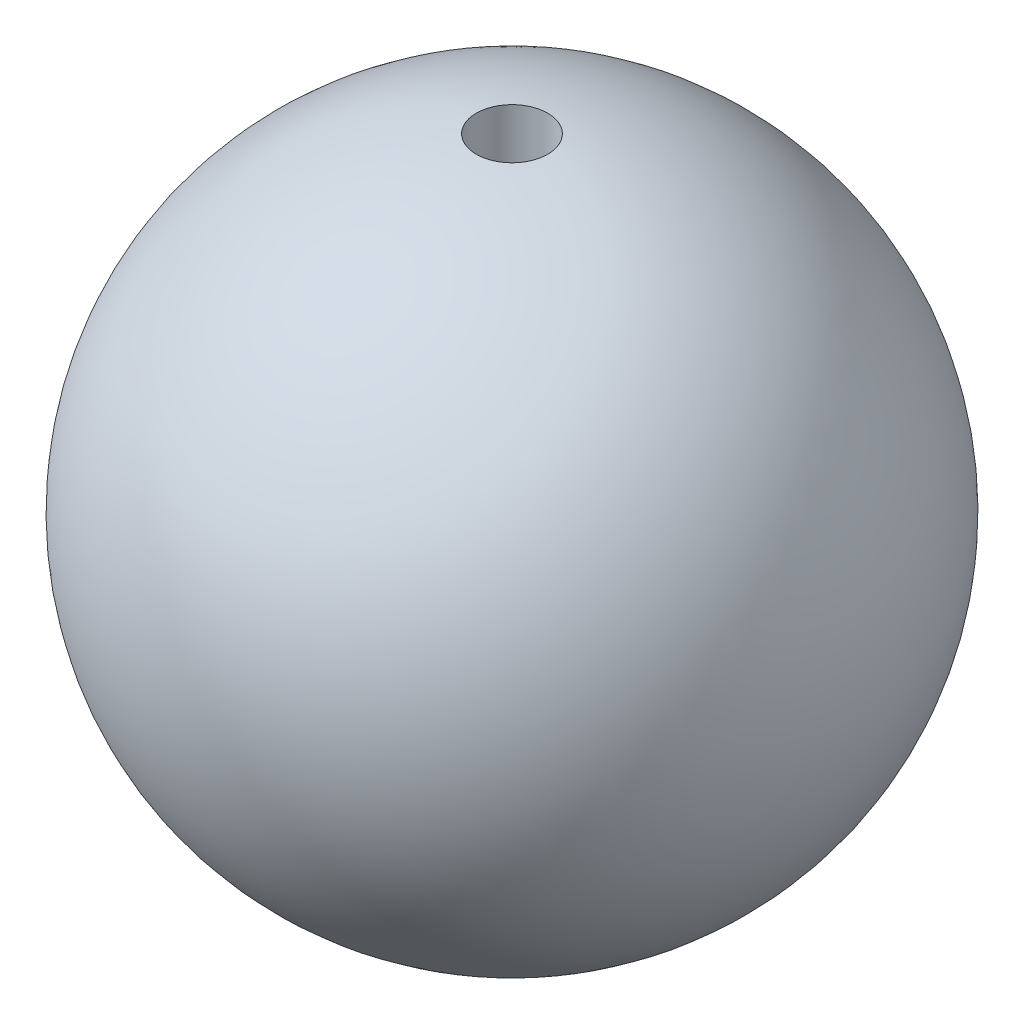
ISO-10303-21;
HEADER;
FILE_DESCRIPTION(('STEP AP214'),'2;1');
FILE_NAME('part.step','',(''),(''),'','','');
FILE_SCHEMA(('AUTOMOTIVE_DESIGN { 1 0 10303 214 1 1 1 1 }'));
ENDSEC;
DATA;
#1=APPLICATION_CONTEXT('core data for automotive mechanical design processes');
#2=APPLICATION_PROTOCOL_DEFINITION('international standard','automotive_design',2000,#1);
#3=PRODUCT_CONTEXT('',#1,'mechanical');
#4=PRODUCT('Part','Part','',(#3));
#5=PRODUCT_RELATED_PRODUCT_CATEGORY('part','',(#4));
#6=PRODUCT_DEFINITION_FORMATION('','',#4);
#7=PRODUCT_DEFINITION_CONTEXT('part definition',#1,'design');
#8=PRODUCT_DEFINITION('design','',#6,#7);
#9=PRODUCT_DEFINITION_SHAPE('','',#8);
#10=(LENGTH_UNIT() NAMED_UNIT(*) SI_UNIT(.MILLI.,.METRE.));
#11=(NAMED_UNIT(*) PLANE_ANGLE_UNIT() SI_UNIT($,.RADIAN.));
#12=(NAMED_UNIT(*) SI_UNIT($,.STERADIAN.) SOLID_ANGLE_UNIT());
#13=UNCERTAINTY_MEASURE_WITH_UNIT(LENGTH_MEASURE(1.E-05),#10,'distance_accuracy_value','');
#14=(GEOMETRIC_REPRESENTATION_CONTEXT(3) GLOBAL_UNCERTAINTY_ASSIGNED_CONTEXT((#13)) GLOBAL_UNIT_ASSIGNED_CONTEXT((#10,
#11,#12)) REPRESENTATION_CONTEXT('',''));
#15=CARTESIAN_POINT('',(0.,0.,0.));
#16=DIRECTION('',(0.,0.,1.));
#17=DIRECTION('',(1.,0.,0.));
#18=AXIS2_PLACEMENT_3D('',#15,#16,#17);
#19=CARTESIAN_POINT('',(0.,0.,0.));
#20=DIRECTION('',(0.,-1.,0.));
#21=DIRECTION('',(-1.,0.,0.));
#22=AXIS2_PLACEMENT_3D('',#19,#20,#21);
#23=SPHERICAL_SURFACE('',#22,924.);
#24=CARTESIAN_POINT('',(0.,-918.572806042069,0.));
#25=DIRECTION('',(0.,-1.,0.));
#26=DIRECTION('',(0.,0.,-1.));
#27=AXIS2_PLACEMENT_3D('',#24,#25,#26);
#28=CIRCLE('',#27,99.9999999999998);
#29=CARTESIAN_POINT('',(-100.000000000001,-918.572806042069,0.));
#30=VERTEX_POINT('',#29);
#31=EDGE_CURVE('E10',#30,#30,#28,.T.);
#32=CARTESIAN_POINT('',(0.,918.572806042069,0.));
#33=DIRECTION('',(0.,-1.,0.));
#34=DIRECTION('',(0.,0.,-1.));
#35=AXIS2_PLACEMENT_3D('',#32,#33,#34);
#36=CIRCLE('',#35,100.);
#37=CARTESIAN_POINT('',(-100.,918.572806042069,0.));
#38=VERTEX_POINT('',#37);
#39=EDGE_CURVE('E52',#38,#38,#36,.T.);
#40=CARTESIAN_POINT('',(-100.000000000001,-918.572806042069,0.));
#41=CARTESIAN_POINT('',(-106.996267866957,-917.811175764544,0.));
#42=CARTESIAN_POINT('',(-113.983830385509,-916.969586036063,0.));
#43=CARTESIAN_POINT('',(-127.937905393556,-915.126992683969,0.));
#44=CARTESIAN_POINT('',(-134.904417883051,-914.125989060355,0.));
#45=CARTESIAN_POINT('',(-148.812753500734,-911.965072924776,0.));
#46=CARTESIAN_POINT('',(-155.754576628922,-910.80516041281,0.));
#47=CARTESIAN_POINT('',(-169.609910025978,-908.327036769075,0.));
#48=CARTESIAN_POINT('',(-176.523420294847,-907.008825637307,0.));
#49=CARTESIAN_POINT('',(-190.318518467541,-904.214791690232,0.));
#50=CARTESIAN_POINT('',(-197.200106371366,-902.738968874926,0.));
#51=CARTESIAN_POINT('',(-210.927767185387,-899.630482382514,0.));
#52=CARTESIAN_POINT('',(-217.773840095583,-897.997818705407,0.));
#53=CARTESIAN_POINT('',(-231.426896778437,-894.576502764093,0.));
#54=CARTESIAN_POINT('',(-238.233880551095,-892.787850499884,0.));
#55=CARTESIAN_POINT('',(-251.805205237425,-889.055491211039,0.));
#56=CARTESIAN_POINT('',(-258.569546151098,-887.111784186402,0.));
#57=CARTESIAN_POINT('',(-272.052053656515,-883.07033012207,0.));
#58=CARTESIAN_POINT('',(-278.770220248259,-880.972583082374,0.));
#59=CARTESIAN_POINT('',(-292.156871754216,-876.624144161279,0.));
#60=CARTESIAN_POINT('',(-298.825356668428,-874.373452279879,0.));
#61=CARTESIAN_POINT('',(-312.109163400753,-869.72029869449,0.));
#62=CARTESIAN_POINT('',(-318.724485218867,-867.3178369905,0.));
#63=CARTESIAN_POINT('',(-331.898512095388,-862.362398014171,0.));
#64=CARTESIAN_POINT('',(-338.457217153795,-859.809420741831,0.));
#65=CARTESIAN_POINT('',(-351.514586405208,-854.5542834626,0.));
#66=CARTESIAN_POINT('',(-358.013250598213,-851.852123455709,0.));
#67=CARTESIAN_POINT('',(-370.947145358689,-846.300031425107,0.));
#68=CARTESIAN_POINT('',(-377.38237592616,-843.450099401396,0.));
#69=CARTESIAN_POINT('',(-390.18604379225,-837.603951202268,0.));
#70=CARTESIAN_POINT('',(-396.55448109087,-834.60773502685,0.));
#71=CARTESIAN_POINT('',(-409.22123764673,-828.47058276005,0.));
#72=CARTESIAN_POINT('',(-415.519556903971,-825.329646668666,0.));
#73=CARTESIAN_POINT('',(-428.042789211098,-818.904694359656,0.));
#74=CARTESIAN_POINT('',(-434.267702260984,-815.620678142029,0.));
#75=CARTESIAN_POINT('',(-446.640872310634,-808.911280068151,0.));
#76=CARTESIAN_POINT('',(-452.789129310398,-805.485898211899,0.));
#77=CARTESIAN_POINT('',(-465.005777436889,-798.495557151205,0.));
#78=CARTESIAN_POINT('',(-471.074168563616,-794.930597946762,0.));
#79=CARTESIAN_POINT('',(-483.127916816727,-787.662963349317,0.));
#80=CARTESIAN_POINT('',(-489.11327394311,-783.960287956316,0.));
#81=CARTESIAN_POINT('',(-500.997829417818,-776.419154038933,0.));
#82=CARTESIAN_POINT('',(-506.897027766143,-772.580695514551,0.));
#83=CARTESIAN_POINT('',(-518.606185887968,-764.769999279936,0.));
#84=CARTESIAN_POINT('',(-524.416145661467,-760.797761569702,0.));
#85=CARTESIAN_POINT('',(-535.94379342569,-752.721580751063,0.));
#86=CARTESIAN_POINT('',(-541.661481416413,-748.617637642659,0.));
#87=CARTESIAN_POINT('',(-553.001600579498,-740.280188574847,0.));
#88=CARTESIAN_POINT('',(-558.62403175186,-736.04668261544,0.));
#89=CARTESIAN_POINT('',(-569.770701973403,-727.452318033721,0.));
#90=CARTESIAN_POINT('',(-575.294941022583,-723.091459411409,0.));
#91=CARTESIAN_POINT('',(-586.24234295614,-714.24466617903,0.));
#92=CARTESIAN_POINT('',(-591.665505840517,-709.758731568963,0.));
#93=CARTESIAN_POINT('',(-602.40792417172,-700.664128334694,0.));
#94=CARTESIAN_POINT('',(-607.727179618546,-696.055459710493,0.));
#95=CARTESIAN_POINT('',(-618.259006048894,-686.71779449737,0.));
#96=CARTESIAN_POINT('',(-623.471577032415,-681.988797908449,0.));
#97=CARTESIAN_POINT('',(-633.787313207202,-672.412945634968,0.));
#98=CARTESIAN_POINT('',(-638.890478398466,-667.566089950408,0.));
#99=CARTESIAN_POINT('',(-648.98473877731,-657.757049885476,0.));
#100=CARTESIAN_POINT('',(-653.975833964888,-652.794865505104,0.));
#101=CARTESIAN_POINT('',(-663.843348633361,-642.757758658069,0.));
#102=CARTESIAN_POINT('',(-668.719768114255,-637.682836191406,0.));
#103=CARTESIAN_POINT('',(-678.35538553515,-627.422902638528,0.));
#104=CARTESIAN_POINT('',(-683.114583475152,-622.237891552313,0.));
#105=CARTESIAN_POINT('',(-692.513273177949,-611.760487701079,0.));
#106=CARTESIAN_POINT('',(-697.152764940745,-606.468094936059,0.));
#107=CARTESIAN_POINT('',(-706.309620147869,-595.778690728757,0.));
#108=CARTESIAN_POINT('',(-710.826983592197,-590.381679286474,0.));
#109=CARTESIAN_POINT('',(-719.737223780701,-579.4858553445,0.));
#110=CARTESIAN_POINT('',(-724.130100524877,-573.987042844809,0.));
#111=CARTESIAN_POINT('',(-732.789073922214,-562.890487555192,0.));
#112=CARTESIAN_POINT('',(-737.055170575375,-557.292744765265,0.));
#113=CARTESIAN_POINT('',(-745.458356587948,-546.001251310924,0.));
#114=CARTESIAN_POINT('',(-749.59544594736,-540.307500646509,0.));
#115=CARTESIAN_POINT('',(-757.73845752059,-528.826963981807,0.));
#116=CARTESIAN_POINT('',(-761.744379734408,-523.04017798152,0.));
#117=CARTESIAN_POINT('',(-769.622965643088,-511.376591754683,0.));
#118=CARTESIAN_POINT('',(-773.495629337951,-505.499791528133,0.));
#119=CARTESIAN_POINT('',(-781.105676405683,-493.659244952141,0.));
#120=CARTESIAN_POINT('',(-784.843059778554,-487.6954986027,0.));
#121=CARTESIAN_POINT('',(-792.180595025116,-475.684173276293,0.));
#122=CARTESIAN_POINT('',(-795.780746898809,-469.636594299328,0.));
#123=CARTESIAN_POINT('',(-802.841939614333,-457.460760979774,0.));
#124=CARTESIAN_POINT('',(-806.302980456164,-451.332506637185,0.));
#125=CARTESIAN_POINT('',(-813.084144201031,-438.998521966503,0.));
#126=CARTESIAN_POINT('',(-816.404267104068,-432.79279163841,0.));
#127=CARTESIAN_POINT('',(-822.901861633495,-420.307094824756,0.));
#128=CARTESIAN_POINT('',(-826.079333259886,-414.027128339195,0.));
#129=CARTESIAN_POINT('',(-832.289966372179,-401.396237795144,0.));
#130=CARTESIAN_POINT('',(-835.323127858081,-395.045313736653,0.));
#131=CARTESIAN_POINT('',(-841.243557165604,-382.275823676124,0.));
#132=CARTESIAN_POINT('',(-844.130824987225,-375.857257674086,0.));
#133=CARTESIAN_POINT('',(-849.757959609157,-362.955834669704,0.));
#134=CARTESIAN_POINT('',(-852.497826409466,-356.47297766736,0.));
#135=CARTESIAN_POINT('',(-857.828728585452,-343.446357170032,0.));
#136=CARTESIAN_POINT('',(-860.419763961128,-336.902593675049,0.));
#137=CARTESIAN_POINT('',(-865.451650585004,-323.757576497586,0.));
#138=CARTESIAN_POINT('',(-867.892501833204,-317.156322815107,0.));
#139=CARTESIAN_POINT('',(-872.62274590597,-303.899771581721,0.));
#140=CARTESIAN_POINT('',(-874.912138730537,-297.244474030815,0.));
#141=CARTESIAN_POINT('',(-879.338270731838,-283.883309594345,0.));
#142=CARTESIAN_POINT('',(-881.475009908573,-277.177442708782,0.));
#143=CARTESIAN_POINT('',(-885.594719085959,-263.718640537523,0.));
#144=CARTESIAN_POINT('',(-887.577689086611,-256.965705251827,0.));
#145=CARTESIAN_POINT('',(-891.388824661917,-243.416291787844,0.));
#146=CARTESIAN_POINT('',(-893.21699023657,-236.619813609556,0.));
#147=CARTESIAN_POINT('',(-896.717562528768,-222.986862600387,0.));
#148=CARTESIAN_POINT('',(-898.389969246312,-216.150389769504,0.));
#149=CARTESIAN_POINT('',(-901.578150710269,-202.441018575164,0.));
#150=CARTESIAN_POINT('',(-903.093925456681,-195.568120211706,0.));
#151=CARTESIAN_POINT('',(-905.968051637265,-181.789486088927,0.));
#152=CARTESIAN_POINT('',(-907.326403071436,-174.883750329606,0.));
#153=CARTESIAN_POINT('',(-909.884973472478,-161.043046695244,0.));
#154=CARTESIAN_POINT('',(-911.085192439348,-154.108078820203,0.));
#155=CARTESIAN_POINT('',(-913.326871307007,-140.212531495768,0.));
#156=CARTESIAN_POINT('',(-914.368331207796,-133.251952046373,0.));
#157=CARTESIAN_POINT('',(-916.291948227917,-119.308815485641,0.));
#158=CARTESIAN_POINT('',(-917.17410534725,-112.326258374303,0.));
#159=CARTESIAN_POINT('',(-918.77865625635,-98.3428118759813,0.));
#160=CARTESIAN_POINT('',(-919.501050046117,-91.3419224889971,0.));
#161=CARTESIAN_POINT('',(-920.785697155682,-77.3254663964173,0.));
#162=CARTESIAN_POINT('',(-921.347950475478,-70.3098996908218,0.));
#163=CARTESIAN_POINT('',(-922.312023109293,-56.2677515806479,0.));
#164=CARTESIAN_POINT('',(-922.71384242331,-49.2411701760696,0.));
#165=CARTESIAN_POINT('',(-923.356837267601,-35.180661038007,0.));
#166=CARTESIAN_POINT('',(-923.598012797874,-28.1467333045227,0.));
#167=CARTESIAN_POINT('',(-923.919594164074,-14.0752037140255,0.));
#168=CARTESIAN_POINT('',(-924.,-7.03760185701254,0.));
#169=CARTESIAN_POINT('',(-924.,7.03760185701336,0.));
#170=CARTESIAN_POINT('',(-923.919594164074,14.0752037140263,0.));
#171=CARTESIAN_POINT('',(-923.598012797874,28.1467333045236,0.));
#172=CARTESIAN_POINT('',(-923.356837267601,35.1806610380078,0.));
#173=CARTESIAN_POINT('',(-922.71384242331,49.2411701760704,0.));
#174=CARTESIAN_POINT('',(-922.312023109293,56.2677515806487,0.));
#175=CARTESIAN_POINT('',(-921.347950475478,70.3098996908226,0.));
#176=CARTESIAN_POINT('',(-920.785697155682,77.3254663964181,0.));
#177=CARTESIAN_POINT('',(-919.501050046117,91.3419224889979,0.));
#178=CARTESIAN_POINT('',(-918.77865625635,98.3428118759821,0.));
#179=CARTESIAN_POINT('',(-917.174105347249,112.326258374304,0.));
#180=CARTESIAN_POINT('',(-916.291948227917,119.308815485642,0.));
#181=CARTESIAN_POINT('',(-914.368331207796,133.251952046374,0.));
#182=CARTESIAN_POINT('',(-913.326871307007,140.212531495768,0.));
#183=CARTESIAN_POINT('',(-911.085192439348,154.108078820204,0.));
#184=CARTESIAN_POINT('',(-909.884973472478,161.043046695244,0.));
#185=CARTESIAN_POINT('',(-907.326403071436,174.883750329606,0.));
#186=CARTESIAN_POINT('',(-905.968051637265,181.789486088928,0.));
#187=CARTESIAN_POINT('',(-903.093925456681,195.568120211707,0.));
#188=CARTESIAN_POINT('',(-901.578150710269,202.441018575164,0.));
#189=CARTESIAN_POINT('',(-898.389969246312,216.150389769505,0.));
#190=CARTESIAN_POINT('',(-896.717562528767,222.986862600387,0.));
#191=CARTESIAN_POINT('',(-893.21699023657,236.619813609557,0.));
#192=CARTESIAN_POINT('',(-891.388824661917,243.416291787845,0.));
#193=CARTESIAN_POINT('',(-887.577689086611,256.965705251828,0.));
#194=CARTESIAN_POINT('',(-885.594719085959,263.718640537524,0.));
#195=CARTESIAN_POINT('',(-881.475009908572,277.177442708782,0.));
#196=CARTESIAN_POINT('',(-879.338270731838,283.883309594345,0.));
#197=CARTESIAN_POINT('',(-874.912138730537,297.244474030815,0.));
#198=CARTESIAN_POINT('',(-872.62274590597,303.899771581722,0.));
#199=CARTESIAN_POINT('',(-867.892501833204,317.156322815108,0.));
#200=CARTESIAN_POINT('',(-865.451650585004,323.757576497587,0.));
#201=CARTESIAN_POINT('',(-860.419763961128,336.90259367505,0.));
#202=CARTESIAN_POINT('',(-857.828728585452,343.446357170033,0.));
#203=CARTESIAN_POINT('',(-852.497826409466,356.472977667361,0.));
#204=CARTESIAN_POINT('',(-849.757959609156,362.955834669705,0.));
#205=CARTESIAN_POINT('',(-844.130824987225,375.857257674087,0.));
#206=CARTESIAN_POINT('',(-841.243557165604,382.275823676124,0.));
#207=CARTESIAN_POINT('',(-835.323127858081,395.045313736653,0.));
#208=CARTESIAN_POINT('',(-832.289966372179,401.396237795144,0.));
#209=CARTESIAN_POINT('',(-826.079333259886,414.027128339196,0.));
#210=CARTESIAN_POINT('',(-822.901861633494,420.307094824757,0.));
#211=CARTESIAN_POINT('',(-816.404267104067,432.792791638411,0.));
#212=CARTESIAN_POINT('',(-813.084144201031,438.998521966504,0.));
#213=CARTESIAN_POINT('',(-806.302980456164,451.332506637186,0.));
#214=CARTESIAN_POINT('',(-802.841939614332,457.460760979775,0.));
#215=CARTESIAN_POINT('',(-795.780746898809,469.636594299329,0.));
#216=CARTESIAN_POINT('',(-792.180595025116,475.684173276294,0.));
#217=CARTESIAN_POINT('',(-784.843059778553,487.695498602701,0.));
#218=CARTESIAN_POINT('',(-781.105676405683,493.659244952142,0.));
#219=CARTESIAN_POINT('',(-773.49562933795,505.499791528133,0.));
#220=CARTESIAN_POINT('',(-769.622965643088,511.376591754683,0.));
#221=CARTESIAN_POINT('',(-761.744379734408,523.040177981521,0.));
#222=CARTESIAN_POINT('',(-757.738457520589,528.826963981808,0.));
#223=CARTESIAN_POINT('',(-749.595445947359,540.30750064651,0.));
#224=CARTESIAN_POINT('',(-745.458356587947,546.001251310925,0.));
#225=CARTESIAN_POINT('',(-737.055170575375,557.292744765266,0.));
#226=CARTESIAN_POINT('',(-732.789073922214,562.890487555192,0.));
#227=CARTESIAN_POINT('',(-724.130100524877,573.98704284481,0.));
#228=CARTESIAN_POINT('',(-719.737223780701,579.485855344501,0.));
#229=CARTESIAN_POINT('',(-710.826983592196,590.381679286475,0.));
#230=CARTESIAN_POINT('',(-706.309620147868,595.778690728757,0.));
#231=CARTESIAN_POINT('',(-697.152764940744,606.46809493606,0.));
#232=CARTESIAN_POINT('',(-692.513273177948,611.760487701079,0.));
#233=CARTESIAN_POINT('',(-683.114583475151,622.237891552314,0.));
#234=CARTESIAN_POINT('',(-678.35538553515,627.422902638529,0.));
#235=CARTESIAN_POINT('',(-668.719768114255,637.682836191406,0.));
#236=CARTESIAN_POINT('',(-663.843348633361,642.757758658069,0.));
#237=CARTESIAN_POINT('',(-653.975833964888,652.794865505105,0.));
#238=CARTESIAN_POINT('',(-648.984738777309,657.757049885477,0.));
#239=CARTESIAN_POINT('',(-638.890478398466,667.566089950409,0.));
#240=CARTESIAN_POINT('',(-633.787313207201,672.412945634969,0.));
#241=CARTESIAN_POINT('',(-623.471577032415,681.988797908449,0.));
#242=CARTESIAN_POINT('',(-618.259006048893,686.717794497371,0.));
#243=CARTESIAN_POINT('',(-607.727179618545,696.055459710493,0.));
#244=CARTESIAN_POINT('',(-602.40792417172,700.664128334695,0.));
#245=CARTESIAN_POINT('',(-591.665505840517,709.758731568963,0.));
#246=CARTESIAN_POINT('',(-586.24234295614,714.24466617903,0.));
#247=CARTESIAN_POINT('',(-575.294941022582,723.091459411409,0.));
#248=CARTESIAN_POINT('',(-569.770701973402,727.452318033722,0.));
#249=CARTESIAN_POINT('',(-558.62403175186,736.046682615441,0.));
#250=CARTESIAN_POINT('',(-553.001600579498,740.280188574848,0.));
#251=CARTESIAN_POINT('',(-541.661481416412,748.617637642659,0.));
#252=CARTESIAN_POINT('',(-535.943793425689,752.721580751064,0.));
#253=CARTESIAN_POINT('',(-524.416145661467,760.797761569702,0.));
#254=CARTESIAN_POINT('',(-518.606185887967,764.769999279936,0.));
#255=CARTESIAN_POINT('',(-506.897027766143,772.580695514552,0.));
#256=CARTESIAN_POINT('',(-500.997829417818,776.419154038934,0.));
#257=CARTESIAN_POINT('',(-489.113273943109,783.960287956317,0.));
#258=CARTESIAN_POINT('',(-483.127916816726,787.662963349318,0.));
#259=CARTESIAN_POINT('',(-471.074168563616,794.930597946762,0.));
#260=CARTESIAN_POINT('',(-465.005777436888,798.495557151205,0.));
#261=CARTESIAN_POINT('',(-452.789129310397,805.485898211899,0.));
#262=CARTESIAN_POINT('',(-446.640872310633,808.911280068151,0.));
#263=CARTESIAN_POINT('',(-434.267702260983,815.62067814203,0.));
#264=CARTESIAN_POINT('',(-428.042789211097,818.904694359657,0.));
#265=CARTESIAN_POINT('',(-415.51955690397,825.329646668667,0.));
#266=CARTESIAN_POINT('',(-409.221237646729,828.47058276005,0.));
#267=CARTESIAN_POINT('',(-396.554481090869,834.607735026851,0.));
#268=CARTESIAN_POINT('',(-390.186043792249,837.603951202268,0.));
#269=CARTESIAN_POINT('',(-377.382375926159,843.450099401396,0.));
#270=CARTESIAN_POINT('',(-370.947145358688,846.300031425107,0.));
#271=CARTESIAN_POINT('',(-358.013250598212,851.852123455709,0.));
#272=CARTESIAN_POINT('',(-351.514586405207,854.5542834626,0.));
#273=CARTESIAN_POINT('',(-338.457217153795,859.809420741831,0.));
#274=CARTESIAN_POINT('',(-331.898512095387,862.362398014172,0.));
#275=CARTESIAN_POINT('',(-318.724485218866,867.317836990501,0.));
#276=CARTESIAN_POINT('',(-312.109163400753,869.72029869449,0.));
#277=CARTESIAN_POINT('',(-298.825356668427,874.373452279879,0.));
#278=CARTESIAN_POINT('',(-292.156871754215,876.624144161279,0.));
#279=CARTESIAN_POINT('',(-278.770220248259,880.972583082374,0.));
#280=CARTESIAN_POINT('',(-272.052053656514,883.07033012207,0.));
#281=CARTESIAN_POINT('',(-258.569546151097,887.111784186402,0.));
#282=CARTESIAN_POINT('',(-251.805205237425,889.055491211039,0.));
#283=CARTESIAN_POINT('',(-238.233880551094,892.787850499885,0.));
#284=CARTESIAN_POINT('',(-231.426896778436,894.576502764093,0.));
#285=CARTESIAN_POINT('',(-217.773840095582,897.997818705408,0.));
#286=CARTESIAN_POINT('',(-210.927767185386,899.630482382514,0.));
#287=CARTESIAN_POINT('',(-197.200106371365,902.738968874926,0.));
#288=CARTESIAN_POINT('',(-190.31851846754,904.214791690232,0.));
#289=CARTESIAN_POINT('',(-176.523420294846,907.008825637307,0.));
#290=CARTESIAN_POINT('',(-169.609910025977,908.327036769076,0.));
#291=CARTESIAN_POINT('',(-155.754576628921,910.80516041281,0.));
#292=CARTESIAN_POINT('',(-148.812753500733,911.965072924776,0.));
#293=CARTESIAN_POINT('',(-134.904417883051,914.125989060355,0.));
#294=CARTESIAN_POINT('',(-127.937905393555,915.126992683969,0.));
#295=CARTESIAN_POINT('',(-113.983830385508,916.969586036063,0.));
#296=CARTESIAN_POINT('',(-106.996267866956,917.811175764544,0.));
#297=CARTESIAN_POINT('',(-100.,918.572806042069,0.));
#298=B_SPLINE_CURVE_WITH_KNOTS('',3,(#40,#41,#42,#43,#44,#45,#46,#47,#48,#49,#50,#51,#52,#53,
#54,#55,#56,#57,#58,#59,#60,#61,#62,#63,#64,#65,#66,#67,#68,#69,#70,#71,#72,#73,#74,#75,#76,#77,
#78,#79,#80,#81,#82,#83,#84,#85,#86,#87,#88,#89,#90,#91,#92,#93,#94,#95,#96,#97,#98,#99,#100,
#101,#102,#103,#104,#105,#106,#107,#108,#109,#110,#111,#112,#113,#114,#115,#116,#117,#118,#119,
#120,#121,#122,#123,#124,#125,#126,#127,#128,#129,#130,#131,#132,#133,#134,#135,#136,#137,#138,
#139,#140,#141,#142,#143,#144,#145,#146,#147,#148,#149,#150,#151,#152,#153,#154,#155,#156,#157,
#158,#159,#160,#161,#162,#163,#164,#165,#166,#167,#168,#169,#170,#171,#172,#173,#174,#175,#176,
#177,#178,#179,#180,#181,#182,#183,#184,#185,#186,#187,#188,#189,#190,#191,#192,#193,#194,#195,
#196,#197,#198,#199,#200,#201,#202,#203,#204,#205,#206,#207,#208,#209,#210,#211,#212,#213,#214,
#215,#216,#217,#218,#219,#220,#221,#222,#223,#224,#225,#226,#227,#228,#229,#230,#231,#232,#233,
#234,#235,#236,#237,#238,#239,#240,#241,#242,#243,#244,#245,#246,#247,#248,#249,#250,#251,#252,
#253,#254,#255,#256,#257,#258,#259,#260,#261,#262,#263,#264,#265,#266,#267,#268,#269,#270,#271,
#272,#273,#274,#275,#276,#277,#278,#279,#280,#281,#282,#283,#284,#285,#286,#287,#288,#289,#290,
#291,#292,#293,#294,#295,#296,#297),.UNSPECIFIED.,.F.,.F.,(4,2,2,2,2,2,2,2,2,2,2,2,2,2,2,2,2,2,
2,2,2,2,2,2,2,2,2,2,2,2,2,2,2,2,2,2,2,2,2,2,2,2,2,2,2,2,2,2,2,2,2,2,2,2,2,2,2,2,2,2,2,2,2,2,2,2,
2,2,2,2,2,2,2,2,2,2,2,2,2,2,2,2,2,2,2,2,2,2,2,2,2,2,2,2,2,2,2,2,2,2,2,2,2,2,2,2,2,2,2,2,2,2,2,2,
2,2,2,2,2,2,2,2,2,2,2,2,2,2,4),(0.,21.1123463205862,42.2246926411723,63.3370389617586,
84.4493852823448,105.561731602931,126.674077923517,147.786424244103,168.89877056469,
190.011116885276,211.123463205862,232.235809526448,253.348155847034,274.460502167621,
295.572848488207,316.685194808793,337.797541129379,358.909887449965,380.022233770552,
401.134580091138,422.246926411724,443.35927273231,464.471619052896,485.583965373483,
506.696311694069,527.808658014655,548.921004335241,570.033350655827,591.145696976414,
612.258043297,633.370389617586,654.482735938172,675.595082258758,696.707428579345,
717.819774899931,738.932121220517,760.044467541103,781.156813861689,802.269160182275,
823.381506502862,844.493852823448,865.606199144034,886.71854546462,907.830891785207,
928.943238105793,950.055584426379,971.167930746965,992.280277067551,1013.39262338814,
1034.50496970872,1055.61731602931,1076.7296623499,1097.84200867048,1118.95435499107,
1140.06670131165,1161.17904763224,1182.29139395283,1203.40374027341,1224.516086594,
1245.62843291459,1266.74077923517,1287.85312555576,1308.96547187634,1330.07781819693,
1351.19016451752,1372.3025108381,1393.41485715869,1414.52720347927,1435.63954979986,
1456.75189612045,1477.86424244103,1498.97658876162,1520.08893508221,1541.20128140279,
1562.31362772338,1583.42597404396,1604.53832036455,1625.65066668514,1646.76301300572,
1667.87535932631,1688.98770564689,1710.10005196748,1731.21239828807,1752.32474460865,
1773.43709092924,1794.54943724983,1815.66178357041,1836.774129891,1857.88647621158,
1878.99882253217,1900.11116885276,1921.22351517334,1942.33586149393,1963.44820781451,
1984.5605541351,2005.67290045569,2026.78524677627,2047.89759309686,2069.00993941745,
2090.12228573803,2111.23463205862,2132.3469783792,2153.45932469979,2174.57167102038,
2195.68401734096,2216.79636366155,2237.90870998214,2259.02105630272,2280.13340262331,
2301.24574894389,2322.35809526448,2343.47044158507,2364.58278790565,2385.69513422624,
2406.80748054682,2427.91982686741,2449.032173188,2470.14451950858,2491.25686582917,
2512.36921214976,2533.48155847034,2554.59390479093,2575.70625111151,2596.8185974321,
2617.93094375269,2639.04329007327,2660.15563639386,2681.26798271444,2702.38032903503),.UNSPECIFIED.);
#299=EDGE_CURVE('BSEAM33',#30,#38,#298,.T.);
#300=ORIENTED_EDGE('',*,*,#31,.F.);
#301=ORIENTED_EDGE('',*,*,#39,.T.);
#302=ORIENTED_EDGE('',*,*,#299,.T.);
#303=ORIENTED_EDGE('',*,*,#299,.F.);
#304=EDGE_LOOP('',(#300,#302,#301,#303));
#305=FACE_BOUND('',#304,.T.);
#306=ADVANCED_FACE('F33',(#305),#23,.T.);
#307=CARTESIAN_POINT('',(0.,0.,0.));
#308=DIRECTION('',(0.,-1.,0.));
#309=DIRECTION('',(0.,0.,-1.));
#310=AXIS2_PLACEMENT_3D('',#307,#308,#309);
#311=CYLINDRICAL_SURFACE('',#310,99.9999999999999);
#312=CARTESIAN_POINT('',(0.,-340.705080756888,0.));
#313=DIRECTION('',(0.,-1.,0.));
#314=DIRECTION('',(0.,0.,-1.));
#315=AXIS2_PLACEMENT_3D('',#312,#313,#314);
#316=CIRCLE('',#315,99.9999999999999);
#317=CARTESIAN_POINT('',(-100.,-340.705080756888,0.));
#318=VERTEX_POINT('',#317);
#319=EDGE_CURVE('E39',#318,#318,#316,.T.);
#320=ORIENTED_EDGE('',*,*,#319,.F.);
#321=EDGE_LOOP('',(#320));
#322=FACE_BOUND('',#321,.T.);
#323=ORIENTED_EDGE('',*,*,#31,.T.);
#324=EDGE_LOOP('',(#323));
#325=FACE_BOUND('',#324,.T.);
#326=ADVANCED_FACE('F71',(#322,#325),#311,.F.);
#327=CARTESIAN_POINT('',(0.,-167.5,0.));
#328=DIRECTION('',(0.,-1.,0.));
#329=DIRECTION('',(-1.,0.,0.));
#330=AXIS2_PLACEMENT_3D('',#327,#328,#329);
#331=SPHERICAL_SURFACE('',#330,200.);
#332=CARTESIAN_POINT('',(0.,-61.0634328358208,0.));
#333=DIRECTION('',(0.,-1.,0.));
#334=DIRECTION('',(0.,0.,-1.));
#335=AXIS2_PLACEMENT_3D('',#332,#333,#334);
#336=CIRCLE('',#335,169.32589043116);
#337=CARTESIAN_POINT('',(-169.32589043116,-61.0634328358208,0.));
#338=VERTEX_POINT('',#337);
#339=EDGE_CURVE('E43',#338,#338,#336,.T.);
#340=CARTESIAN_POINT('',(-169.32589043116,-61.0634328358208,0.));
#341=CARTESIAN_POINT('',(-170.217508279654,-62.4818648231653,0.));
#342=CARTESIAN_POINT('',(-171.091294849793,-63.9115051289156,0.));
#343=CARTESIAN_POINT('',(-172.802671642443,-66.7922888117536,0.));
#344=CARTESIAN_POINT('',(-173.640261864953,-68.2434321888412,0.));
#345=CARTESIAN_POINT('',(-175.278712171422,-71.1663084488795,0.));
#346=CARTESIAN_POINT('',(-176.07957225538,-72.6380413318302,0.));
#347=CARTESIAN_POINT('',(-177.64405781491,-75.6011663966216,0.));
#348=CARTESIAN_POINT('',(-178.407683290481,-77.0925585784622,0.));
#349=CARTESIAN_POINT('',(-179.897217036834,-80.0940605936784,0.));
#350=CARTESIAN_POINT('',(-180.623125307616,-81.604170427054,0.));
#351=CARTESIAN_POINT('',(-182.036766307156,-84.6421540160499,0.));
#352=CARTESIAN_POINT('',(-182.724499035914,-86.1700277716703,0.));
#353=CARTESIAN_POINT('',(-184.061354605195,-89.2425743274822,0.));
#354=CARTESIAN_POINT('',(-184.710477445719,-90.7872471276737,0.));
#355=CARTESIAN_POINT('',(-185.969703307055,-93.892416267159,0.));
#356=CARTESIAN_POINT('',(-186.579806327869,-95.4529126064528,0.));
#357=CARTESIAN_POINT('',(-187.760607251891,-98.5887433307186,0.));
#358=CARTESIAN_POINT('',(-188.3313051551,-100.164077715691,0.));
#359=CARTESIAN_POINT('',(-189.432935433654,-103.328589665926,0.));
#360=CARTESIAN_POINT('',(-189.963867809,-104.917767231189,0.));
#361=CARTESIAN_POINT('',(-190.985631733939,-108.108961934648,0.));
#362=CARTESIAN_POINT('',(-191.476463283533,-109.710979072843,0.));
#363=CARTESIAN_POINT('',(-192.417715583967,-112.926841206184,0.));
#364=CARTESIAN_POINT('',(-192.868136334808,-114.540686201329,0.));
#365=CARTESIAN_POINT('',(-193.728282585176,-117.779184863007,0.));
#366=CARTESIAN_POINT('',(-194.138008084703,-119.403838529541,0.));
#367=CARTESIAN_POINT('',(-194.916505080014,-122.66292852247,0.));
#368=CARTESIAN_POINT('',(-195.285276575799,-124.297364848865,0.));
#369=CARTESIAN_POINT('',(-195.981632674726,-127.574987971984,0.));
#370=CARTESIAN_POINT('',(-196.309217277868,-129.218174768708,0.));
#371=CARTESIAN_POINT('',(-196.922992713216,-132.5122611168,0.));
#372=CARTESIAN_POINT('',(-197.209183545422,-134.163160668167,0.));
#373=CARTESIAN_POINT('',(-197.739990701859,-137.471629939053,0.));
#374=CARTESIAN_POINT('',(-197.98460702609,-139.129199658571,0.));
#375=CARTESIAN_POINT('',(-198.432110684933,-142.449962466878,0.));
#376=CARTESIAN_POINT('',(-198.634998019546,-144.113155555668,0.));
#377=CARTESIAN_POINT('',(-198.998915570465,-147.444114752334,0.));
#378=CARTESIAN_POINT('',(-199.15994578677,-149.11188086021,0.));
#379=CARTESIAN_POINT('',(-199.440047406258,-152.450932856882,0.));
#380=CARTESIAN_POINT('',(-199.559118809439,-154.122218745678,0.));
#381=CARTESIAN_POINT('',(-199.755227605955,-157.467254843188,0.));
#382=CARTESIAN_POINT('',(-199.832264999289,-159.141005051903,0.));
#383=CARTESIAN_POINT('',(-199.94425712497,-162.489912771967,0.));
#384=CARTESIAN_POINT('',(-199.979211857316,-164.165070283316,0.));
#385=CARTESIAN_POINT('',(-200.007016586188,-167.515734702617,0.));
#386=CARTESIAN_POINT('',(-199.999866582713,-169.191241610569,0.));
#387=CARTESIAN_POINT('',(-199.943466355359,-172.541546696389,0.));
#388=CARTESIAN_POINT('',(-199.894216131479,-174.216344874257,0.));
#389=CARTESIAN_POINT('',(-199.753646566126,-177.564174820807,0.));
#390=CARTESIAN_POINT('',(-199.662327224652,-179.237206589488,0.));
#391=CARTESIAN_POINT('',(-199.437677094678,-182.580447154093,0.));
#392=CARTESIAN_POINT('',(-199.304346306177,-184.250655950017,0.));
#393=CARTESIAN_POINT('',(-198.995757484048,-187.587195788319,0.));
#394=CARTESIAN_POINT('',(-198.82049945042,-189.253526830697,0.));
#395=CARTESIAN_POINT('',(-198.428166818095,-192.581258830022,0.));
#396=CARTESIAN_POINT('',(-198.211092219398,-194.242659786969,0.));
#397=CARTESIAN_POINT('',(-197.735263545255,-197.559482397025,0.));
#398=CARTESIAN_POINT('',(-197.476509469808,-199.214904050135,0.));
#399=CARTESIAN_POINT('',(-196.91748525217,-202.518722610197,0.));
#400=CARTESIAN_POINT('',(-196.617215109978,-204.16711951715,0.));
#401=CARTESIAN_POINT('',(-195.975348387344,-207.455847578893,0.));
#402=CARTESIAN_POINT('',(-195.633751806901,-209.096178733682,0.));
#403=CARTESIAN_POINT('',(-194.909447934989,-212.367739378826,0.));
#404=CARTESIAN_POINT('',(-194.526740643521,-213.99896886918,0.));
#405=CARTESIAN_POINT('',(-193.720457039279,-217.25129602112,0.));
#406=CARTESIAN_POINT('',(-193.296880726507,-218.872393682707,0.));
#407=CARTESIAN_POINT('',(-192.409126579241,-222.103433411298,0.));
#408=CARTESIAN_POINT('',(-191.944948744748,-223.713375478301,0.));
#409=CARTESIAN_POINT('',(-190.976284694554,-226.921087296963,0.));
#410=CARTESIAN_POINT('',(-190.471798478852,-228.51885704862,0.));
#411=CARTESIAN_POINT('',(-189.422836262557,-231.701215202961,0.));
#412=CARTESIAN_POINT('',(-188.878360261963,-233.285803605646,0.));
#413=CARTESIAN_POINT('',(-187.749762326799,-236.440798352782,0.));
#414=CARTESIAN_POINT('',(-187.165640392229,-238.011204697235,0.));
#415=CARTESIAN_POINT('',(-185.958119477479,-241.136843574994,0.));
#416=CARTESIAN_POINT('',(-185.334720497299,-242.692076108301,0.));
#417=CARTESIAN_POINT('',(-184.049039184184,-245.786385193513,0.));
#418=CARTESIAN_POINT('',(-183.386756851249,-247.325461745418,0.));
#419=CARTESIAN_POINT('',(-182.023727081338,-250.386486900502,0.));
#420=CARTESIAN_POINT('',(-181.322979644362,-251.90843550368,0.));
#421=CARTESIAN_POINT('',(-179.883462206807,-254.934243610731,0.));
#422=CARTESIAN_POINT('',(-179.144692206229,-256.438103114604,0.));
#423=CARTESIAN_POINT('',(-177.629596194159,-259.42678329621,0.));
#424=CARTESIAN_POINT('',(-176.853270182667,-260.911603973944,0.));
#425=CARTESIAN_POINT('',(-175.263552419067,-263.861268799956,0.));
#426=CARTESIAN_POINT('',(-174.450160666959,-265.326112948234,0.));
#427=CARTESIAN_POINT('',(-172.786825100413,-268.234899627725,0.));
#428=CARTESIAN_POINT('',(-171.936881285975,-269.678842158937,0.));
#429=CARTESIAN_POINT('',(-170.200978356647,-272.544913716604,0.));
#430=CARTESIAN_POINT('',(-169.315019241756,-273.967042743059,0.));
#431=CARTESIAN_POINT('',(-167.507645218007,-276.788589179323,0.));
#432=CARTESIAN_POINT('',(-166.586230309148,-278.188006589132,0.));
#433=CARTESIAN_POINT('',(-164.708526595217,-280.9632460232,0.));
#434=CARTESIAN_POINT('',(-163.752237790143,-282.339068047459,0.));
#435=CARTESIAN_POINT('',(-161.805390205316,-285.066247842626,0.));
#436=CARTESIAN_POINT('',(-160.814831425562,-286.417605613535,0.));
#437=CARTESIAN_POINT('',(-158.8000694553,-289.095003484026,0.));
#438=CARTESIAN_POINT('',(-157.775866264792,-290.421043583606,0.));
#439=CARTESIAN_POINT('',(-155.694462284277,-293.046968682236,0.));
#440=CARTESIAN_POINT('',(-154.63726149427,-294.346853681285,0.));
#441=CARTESIAN_POINT('',(-152.490529964865,-296.919647667281,0.));
#442=CARTESIAN_POINT('',(-151.400999225467,-298.192556654228,0.));
#443=CARTESIAN_POINT('',(-149.190295864602,-300.710594740512,0.));
#444=CARTESIAN_POINT('',(-148.069123243135,-301.95572383985,0.));
#445=CARTESIAN_POINT('',(-145.795844168133,-304.417415819134,0.));
#446=CARTESIAN_POINT('',(-144.643737714598,-305.633978699081,0.));
#447=CARTESIAN_POINT('',(-142.309318560995,-308.037769948134,0.));
#448=CARTESIAN_POINT('',(-141.127005860928,-309.224998317239,0.));
#449=CARTESIAN_POINT('',(-138.732920875812,-311.569370778631,0.));
#450=CARTESIAN_POINT('',(-137.521148590762,-312.726514870917,0.));
#451=CARTESIAN_POINT('',(-135.068909701832,-315.009988011864,0.));
#452=CARTESIAN_POINT('',(-133.828443097951,-316.136317060525,0.));
#453=CARTESIAN_POINT('',(-131.319598958357,-318.357448807325,0.));
#454=CARTESIAN_POINT('',(-130.051221422644,-319.452251505465,0.));
#455=CARTESIAN_POINT('',(-127.487356434248,-321.609639156293,0.));
#456=CARTESIAN_POINT('',(-126.191868981565,-322.672224108983,0.));
#457=CARTESIAN_POINT('',(-123.574602289585,-324.764505211943,0.));
#458=CARTESIAN_POINT('',(-122.252823050288,-325.794201362213,0.));
#459=CARTESIAN_POINT('',(-119.583807538546,-327.820054604841,0.));
#460=CARTESIAN_POINT('',(-118.2365712661,-328.816211697199,0.));
#461=CARTESIAN_POINT('',(-115.517492446823,-330.774357632371,0.));
#462=CARTESIAN_POINT('',(-114.145649899992,-331.736346475185,0.));
#463=CARTESIAN_POINT('',(-111.378225097017,-333.625548734196,0.));
#464=CARTESIAN_POINT('',(-109.982642840873,-334.552762150392,0.));
#465=CARTESIAN_POINT('',(-107.16861918088,-336.37182671199,0.));
#466=CARTESIAN_POINT('',(-105.75017777703,-337.263677857391,0.));
#467=CARTESIAN_POINT('',(-102.891334535459,-339.011459443817,0.));
#468=CARTESIAN_POINT('',(-101.450932697738,-339.867389884841,0.));
#469=CARTESIAN_POINT('',(-100.,-340.705080756888,0.));
#470=B_SPLINE_CURVE_WITH_KNOTS('',3,(#340,#341,#342,#343,#344,#345,#346,#347,#348,#349,#350,
#351,#352,#353,#354,#355,#356,#357,#358,#359,#360,#361,#362,#363,#364,#365,#366,#367,#368,#369,
#370,#371,#372,#373,#374,#375,#376,#377,#378,#379,#380,#381,#382,#383,#384,#385,#386,#387,#388,
#389,#390,#391,#392,#393,#394,#395,#396,#397,#398,#399,#400,#401,#402,#403,#404,#405,#406,#407,
#408,#409,#410,#411,#412,#413,#414,#415,#416,#417,#418,#419,#420,#421,#422,#423,#424,#425,#426,
#427,#428,#429,#430,#431,#432,#433,#434,#435,#436,#437,#438,#439,#440,#441,#442,#443,#444,#445,
#446,#447,#448,#449,#450,#451,#452,#453,#454,#455,#456,#457,#458,#459,#460,#461,#462,#463,#464,
#465,#466,#467,#468,#469),.UNSPECIFIED.,.F.,.F.,(4,2,2,2,2,2,2,2,2,2,2,2,2,2,2,2,2,2,2,2,2,2,2,
2,2,2,2,2,2,2,2,2,2,2,2,2,2,2,2,2,2,2,2,2,2,2,2,2,2,2,2,2,2,2,2,2,2,2,2,2,2,2,2,2,4),(0.,
5.02603742302392,10.0520748460478,15.0781122690717,20.1041496920957,25.1301871151196,
30.1562245381435,35.1822619611674,40.2082993841913,45.2343368072152,50.2603742302392,
55.2864116532631,60.312449076287,65.3384864993109,70.3645239223348,75.3905613453587,
80.4165987683826,85.4426361914066,90.4686736144305,95.4947110374544,100.520748460478,
105.546785883502,110.572823306526,115.59886072955,120.624898152574,125.650935575598,
130.676972998622,135.703010421646,140.72904784467,145.755085267694,150.781122690718,
155.807160113741,160.833197536765,165.859234959789,170.885272382813,175.911309805837,
180.937347228861,185.963384651885,190.989422074909,196.015459497933,201.041496920957,
206.067534343981,211.093571767005,216.119609190028,221.145646613052,226.171684036076,
231.1977214591,236.223758882124,241.249796305148,246.275833728172,251.301871151196,
256.32790857422,261.353945997244,266.379983420268,271.406020843292,276.432058266315,
281.458095689339,286.484133112363,291.510170535387,296.536207958411,301.562245381435,
306.588282804459,311.614320227483,316.640357650507,321.666395073531),.UNSPECIFIED.);
#471=EDGE_CURVE('BSEAM66',#338,#318,#470,.T.);
#472=ORIENTED_EDGE('',*,*,#339,.F.);
#473=ORIENTED_EDGE('',*,*,#319,.T.);
#474=ORIENTED_EDGE('',*,*,#471,.T.);
#475=ORIENTED_EDGE('',*,*,#471,.F.);
#476=EDGE_LOOP('',(#472,#474,#473,#475));
#477=FACE_BOUND('',#476,.T.);
#478=ADVANCED_FACE('F66',(#477),#331,.F.);
#479=CARTESIAN_POINT('',(0.,0.,0.));
#480=DIRECTION('',(0.,-1.,0.));
#481=DIRECTION('',(-1.,0.,0.));
#482=AXIS2_PLACEMENT_3D('',#479,#480,#481);
#483=SPHERICAL_SURFACE('',#482,180.);
#484=CARTESIAN_POINT('',(0.,149.666295470958,0.));
#485=DIRECTION('',(0.,-1.,0.));
#486=DIRECTION('',(0.,0.,-1.));
#487=AXIS2_PLACEMENT_3D('',#484,#485,#486);
#488=CIRCLE('',#487,99.9999999999999);
#489=CARTESIAN_POINT('',(-99.9999999999999,149.666295470958,0.));
#490=VERTEX_POINT('',#489);
#491=EDGE_CURVE('E47',#490,#490,#488,.T.);
#492=CARTESIAN_POINT('',(-99.9999999999999,149.666295470958,0.));
#493=CARTESIAN_POINT('',(-101.035096049761,148.974695232173,0.));
#494=CARTESIAN_POINT('',(-102.063015164451,148.272353669675,0.));
#495=CARTESIAN_POINT('',(-104.10406206068,146.846497419928,0.));
#496=CARTESIAN_POINT('',(-105.117189842219,146.12298273268,0.));
#497=CARTESIAN_POINT('',(-107.12821660914,144.655089756112,0.));
#498=CARTESIAN_POINT('',(-108.126115594522,143.910711466793,0.));
#499=CARTESIAN_POINT('',(-110.106255567684,142.401412232015,0.));
#500=CARTESIAN_POINT('',(-111.088496555464,141.636491286556,0.));
#501=CARTESIAN_POINT('',(-113.036897615078,140.086435873977,0.));
#502=CARTESIAN_POINT('',(-114.003057686912,139.301301406856,0.));
#503=CARTESIAN_POINT('',(-115.918881041074,137.711156962012,0.));
#504=CARTESIAN_POINT('',(-116.868544323403,136.906146984288,0.));
#505=CARTESIAN_POINT('',(-118.750965293486,135.276598038053,0.));
#506=CARTESIAN_POINT('',(-119.683722981241,134.452059069542,0.));
#507=CARTESIAN_POINT('',(-121.531931243196,132.783807080712,0.));
#508=CARTESIAN_POINT('',(-122.447381817395,131.940094060394,0.));
#509=CARTESIAN_POINT('',(-124.26058178103,130.233857157339,0.));
#510=CARTESIAN_POINT('',(-125.158331170466,129.371333274603,0.));
#511=CARTESIAN_POINT('',(-126.935742313761,127.627845934454,0.));
#512=CARTESIAN_POINT('',(-127.815404067621,126.746882477041,0.));
#513=CARTESIAN_POINT('',(-129.556261274904,124.966895212651,0.));
#514=CARTESIAN_POINT('',(-130.417456728327,124.067871405674,0.));
#515=CARTESIAN_POINT('',(-132.121010619041,122.252150441709,0.));
#516=CARTESIAN_POINT('',(-132.963369056332,121.335453284721,0.));
#517=CARTESIAN_POINT('',(-134.62888630778,119.484780228054,0.));
#518=CARTESIAN_POINT('',(-135.452045121936,118.550804328374,0.));
#519=CARTESIAN_POINT('',(-137.078808784905,116.665975831562,0.));
#520=CARTESIAN_POINT('',(-137.882413633718,115.715123234431,0.));
#521=CARTESIAN_POINT('',(-139.469723441116,113.79695065281,0.));
#522=CARTESIAN_POINT('',(-140.253428399701,112.829630668319,0.));
#523=CARTESIAN_POINT('',(-141.800601067994,110.878939710726,0.));
#524=CARTESIAN_POINT('',(-142.564068777702,109.895568737625,0.));
#525=CARTESIAN_POINT('',(-144.070438301047,107.913199110969,0.));
#526=CARTESIAN_POINT('',(-144.813340114683,106.914200457416,0.));
#527=CARTESIAN_POINT('',(-146.278258051618,104.901005505208,0.));
#528=CARTESIAN_POINT('',(-147.000274174916,103.886809206554,0.));
#529=CARTESIAN_POINT('',(-148.423109927494,101.843655541571,0.));
#530=CARTESIAN_POINT('',(-149.123929556775,100.814698175243,0.));
#531=CARTESIAN_POINT('',(-150.504070642018,98.7424653064825,0.));
#532=CARTESIAN_POINT('',(-151.18339209798,97.6991898040502,0.));
#533=CARTESIAN_POINT('',(-152.520244411527,95.598769758128,0.));
#534=CARTESIAN_POINT('',(-153.177775269111,94.5416252146381,0.));
#535=CARTESIAN_POINT('',(-154.470763340963,92.4139221518035,0.));
#536=CARTESIAN_POINT('',(-155.10622055523,91.3433636324588,0.));
#537=CARTESIAN_POINT('',(-156.354787797471,89.1892934573831,0.));
#538=CARTESIAN_POINT('',(-156.967897825444,88.1057818016521,0.));
#539=CARTESIAN_POINT('',(-158.171506771831,85.9262717691623,0.));
#540=CARTESIAN_POINT('',(-158.762005690245,84.8302733924035,0.));
#541=CARTESIAN_POINT('',(-159.920138227572,82.6262617083303,0.));
#542=CARTESIAN_POINT('',(-160.487771846486,81.518248401016,0.));
#543=CARTESIAN_POINT('',(-161.599929437612,79.290683818328,0.));
#544=CARTESIAN_POINT('',(-162.144453409826,78.1711325429543,0.));
#545=CARTESIAN_POINT('',(-163.210157308281,75.9209739533513,0.));
#546=CARTESIAN_POINT('',(-163.731337234523,74.790366639122,0.));
#547=CARTESIAN_POINT('',(-164.750128690589,72.5185826602646,0.));
#548=CARTESIAN_POINT('',(-165.247740220414,71.3774059956366,0.));
#549=CARTESIAN_POINT('',(-166.219180678604,69.0849745541888,0.));
#550=CARTESIAN_POINT('',(-166.69300960697,67.9337197773691,0.));
#551=CARTESIAN_POINT('',(-167.61668089481,65.6216276880338,0.));
#552=CARTESIAN_POINT('',(-168.066523254284,64.4607903755182,0.));
#553=CARTESIAN_POINT('',(-168.942027762323,62.1300329162465,0.));
#554=CARTESIAN_POINT('',(-169.367689910887,60.9601127694903,0.));
#555=CARTESIAN_POINT('',(-170.194650763853,58.6116932530478,0.));
#556=CARTESIAN_POINT('',(-170.595949468256,57.4331938833614,0.));
#557=CARTESIAN_POINT('',(-171.374010687291,55.0681232254358,0.));
#558=CARTESIAN_POINT('',(-171.750773201924,53.8815519371966,0.));
#559=CARTESIAN_POINT('',(-172.479599857818,51.5008482212326,0.));
#560=CARTESIAN_POINT('',(-172.831663999079,50.3067157935078,0.));
#561=CARTESIAN_POINT('',(-173.510942356448,47.9114038324562,0.));
#562=CARTESIAN_POINT('',(-173.838156572556,46.7102242991294,0.));
#563=CARTESIAN_POINT('',(-174.467594224892,44.3013351942995,0.));
#564=CARTESIAN_POINT('',(-174.769817661121,43.0936256227965,0.));
#565=CARTESIAN_POINT('',(-175.349143656667,40.672196320002,0.));
#566=CARTESIAN_POINT('',(-175.626246215984,39.4584765887106,0.));
#567=CARTESIAN_POINT('',(-176.155211174366,37.025549431899,0.));
#568=CARTESIAN_POINT('',(-176.40707357343,35.8063420063788,0.));
#569=CARTESIAN_POINT('',(-176.885449793007,33.3629642889372,0.));
#570=CARTESIAN_POINT('',(-177.11196361352,32.1387939970158,0.));
#571=CARTESIAN_POINT('',(-177.539545169405,29.6860175109466,0.));
#572=CARTESIAN_POINT('',(-177.740612904777,28.4574113167989,0.));
#573=CARTESIAN_POINT('',(-178.117215737479,25.9962918999586,0.));
#574=CARTESIAN_POINT('',(-178.292750834808,24.7637786772661,0.));
#575=CARTESIAN_POINT('',(-178.618212829461,22.2953757588625,0.));
#576=CARTESIAN_POINT('',(-178.768139726785,21.0594860631514,0.));
#577=CARTESIAN_POINT('',(-179.042320782938,18.584862207695,0.));
#578=CARTESIAN_POINT('',(-179.166574941766,17.3461280479497,0.));
#579=CARTESIAN_POINT('',(-179.389357033687,14.8663484978553,0.));
#580=CARTESIAN_POINT('',(-179.48788496678,13.6253031075063,0.));
#581=CARTESIAN_POINT('',(-179.659172194265,11.1414353245421,0.));
#582=CARTESIAN_POINT('',(-179.731931488657,9.89861293192693,0.));
#583=CARTESIAN_POINT('',(-179.85165011831,7.41172613770792,0.));
#584=CARTESIAN_POINT('',(-179.898609453571,6.16766173610406,0.));
#585=CARTESIAN_POINT('',(-179.966707950545,3.67882645182814,0.));
#586=CARTESIAN_POINT('',(-179.987847112258,2.43405556915609,0.));
#587=CARTESIAN_POINT('',(-180.004296162439,-0.0556568452193371,0.));
#588=CARTESIAN_POINT('',(-179.999606050906,-1.30059837692271,0.));
#589=CARTESIAN_POINT('',(-179.96439857353,-3.7901161838652,0.));
#590=CARTESIAN_POINT('',(-179.933881207686,-5.03469245910431,0.));
#591=CARTESIAN_POINT('',(-179.847032358388,-7.52294400485338,0.));
#592=CARTESIAN_POINT('',(-179.790700874935,-8.76661927536334,0.));
#593=CARTESIAN_POINT('',(-179.652248039227,-11.2525334512414,0.));
#594=CARTESIAN_POINT('',(-179.570126686974,-12.4947723566095,0.));
#595=CARTESIAN_POINT('',(-179.38012946415,-14.9772790600982,0.));
#596=CARTESIAN_POINT('',(-179.27225359358,-16.2175468582188,0.));
#597=CARTESIAN_POINT('',(-179.03079377106,-18.6955774536019,0.));
#598=CARTESIAN_POINT('',(-178.897209819109,-19.9333402508644,0.));
#599=CARTESIAN_POINT('',(-178.604391337234,-22.4058280292409,0.));
#600=CARTESIAN_POINT('',(-178.44515680731,-23.640553010355,0.));
#601=CARTESIAN_POINT('',(-178.101105714586,-26.1064336488157,0.));
#602=CARTESIAN_POINT('',(-177.916289151786,-27.3375893061623,0.));
#603=CARTESIAN_POINT('',(-177.521153550691,-29.795801325968,0.));
#604=CARTESIAN_POINT('',(-177.310834512395,-31.0228576884271,0.));
#605=CARTESIAN_POINT('',(-176.864784495365,-33.4723429118522,0.));
#606=CARTESIAN_POINT('',(-176.629053516631,-34.6947717728182,0.));
#607=CARTESIAN_POINT('',(-176.132281093813,-37.1344757789878,0.));
#608=CARTESIAN_POINT('',(-175.871239649729,-38.3517509241913,0.));
#609=CARTESIAN_POINT('',(-175.323958662708,-40.7806235017527,0.));
#610=CARTESIAN_POINT('',(-175.03771911977,-41.9922209341106,0.));
#611=CARTESIAN_POINT('',(-174.44016516302,-44.4092165378708,0.));
#612=CARTESIAN_POINT('',(-174.128850749208,-45.6146147092731,0.));
#613=CARTESIAN_POINT('',(-173.481281018276,-48.0186928932664,0.));
#614=CARTESIAN_POINT('',(-173.145025701156,-49.2173729058572,0.));
#615=CARTESIAN_POINT('',(-172.447719070061,-51.607498834683,0.));
#616=CARTESIAN_POINT('',(-172.086667756085,-52.7989447509178,0.));
#617=CARTESIAN_POINT('',(-171.339923955213,-55.1740894083628,0.));
#618=CARTESIAN_POINT('',(-170.954231468316,-56.3577881495728,0.));
#619=CARTESIAN_POINT('',(-170.158373575515,-58.7169296654668,0.));
#620=CARTESIAN_POINT('',(-169.748208169611,-59.8923724401507,0.));
#621=CARTESIAN_POINT('',(-169.32589043116,-61.0634328358208,0.));
#622=B_SPLINE_CURVE_WITH_KNOTS('',3,(#492,#493,#494,#495,#496,#497,#498,#499,#500,#501,#502,
#503,#504,#505,#506,#507,#508,#509,#510,#511,#512,#513,#514,#515,#516,#517,#518,#519,#520,#521,
#522,#523,#524,#525,#526,#527,#528,#529,#530,#531,#532,#533,#534,#535,#536,#537,#538,#539,#540,
#541,#542,#543,#544,#545,#546,#547,#548,#549,#550,#551,#552,#553,#554,#555,#556,#557,#558,#559,
#560,#561,#562,#563,#564,#565,#566,#567,#568,#569,#570,#571,#572,#573,#574,#575,#576,#577,#578,
#579,#580,#581,#582,#583,#584,#585,#586,#587,#588,#589,#590,#591,#592,#593,#594,#595,#596,#597,
#598,#599,#600,#601,#602,#603,#604,#605,#606,#607,#608,#609,#610,#611,#612,#613,#614,#615,#616,
#617,#618,#619,#620,#621),.UNSPECIFIED.,.F.,.F.,(4,2,2,2,2,2,2,2,2,2,2,2,2,2,2,2,2,2,2,2,2,2,2,
2,2,2,2,2,2,2,2,2,2,2,2,2,2,2,2,2,2,2,2,2,2,2,2,2,2,2,2,2,2,2,2,2,2,2,2,2,2,2,2,2,4),(0.,
3.73458314419724,7.46916628839447,11.2037494325917,14.938332576789,18.6729157209862,
22.4074988651834,26.1420820093807,29.8766651535779,33.6112482977752,37.3458314419724,
41.0804145861696,44.8149977303669,48.5495808745641,52.2841640187613,56.0187471629586,
59.7533303071558,63.487913451353,67.2224965955503,70.9570797397475,74.6916628839448,
78.426246028142,82.1608291723392,85.8954123165365,89.6299954607337,93.364578604931,
97.0991617491282,100.833744893325,104.568328037523,108.30291118172,112.037494325917,
115.772077470114,119.506660614312,123.241243758509,126.975826902706,130.710410046903,
134.444993191101,138.179576335298,141.914159479495,145.648742623692,149.38332576789,
153.117908912087,156.852492056284,160.587075200481,164.321658344678,168.056241488876,
171.790824633073,175.52540777727,179.259990921467,182.994574065665,186.729157209862,
190.463740354059,194.198323498256,197.932906642454,201.667489786651,205.402072930848,
209.136656075045,212.871239219242,216.60582236344,220.340405507637,224.074988651834,
227.809571796031,231.544154940229,235.278738084426,239.013321228623),.UNSPECIFIED.);
#623=EDGE_CURVE('BSEAM60',#490,#338,#622,.T.);
#624=ORIENTED_EDGE('',*,*,#491,.F.);
#625=ORIENTED_EDGE('',*,*,#339,.T.);
#626=ORIENTED_EDGE('',*,*,#623,.T.);
#627=ORIENTED_EDGE('',*,*,#623,.F.);
#628=EDGE_LOOP('',(#624,#626,#625,#627));
#629=FACE_BOUND('',#628,.T.);
#630=ADVANCED_FACE('F60',(#629),#483,.F.);
#631=CARTESIAN_POINT('',(0.,0.,0.));
#632=DIRECTION('',(0.,-1.,0.));
#633=DIRECTION('',(0.,0.,-1.));
#634=AXIS2_PLACEMENT_3D('',#631,#632,#633);
#635=CYLINDRICAL_SURFACE('',#634,100.);
#636=ORIENTED_EDGE('',*,*,#39,.F.);
#637=EDGE_LOOP('',(#636));
#638=FACE_BOUND('',#637,.T.);
#639=ORIENTED_EDGE('',*,*,#491,.T.);
#640=EDGE_LOOP('',(#639));
#641=FACE_BOUND('',#640,.T.);
#642=ADVANCED_FACE('F57',(#638,#641),#635,.F.);
#643=CLOSED_SHELL('',(#306,#326,#478,#630,#642));
#644=MANIFOLD_SOLID_BREP('B2',#643);
#645=ADVANCED_BREP_SHAPE_REPRESENTATION('',(#18,#644),#14);
#646=SHAPE_DEFINITION_REPRESENTATION(#9,#645);
ENDSEC;
END-ISO-10303-21;
